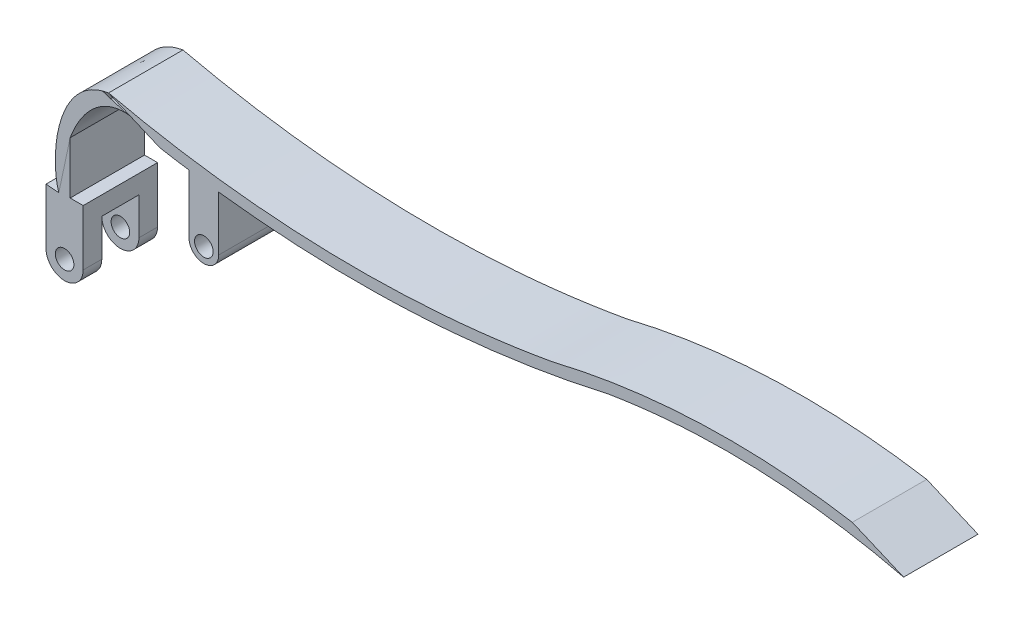
ISO-10303-21;
HEADER;
FILE_DESCRIPTION(('STEP AP214'),'2;1');
FILE_NAME('part.step','',(''),(''),'','','');
FILE_SCHEMA(('AUTOMOTIVE_DESIGN { 1 0 10303 214 1 1 1 1 }'));
ENDSEC;
DATA;
#1=APPLICATION_CONTEXT('core data for automotive mechanical design processes');
#2=APPLICATION_PROTOCOL_DEFINITION('international standard','automotive_design',2000,#1);
#3=PRODUCT_CONTEXT('',#1,'mechanical');
#4=PRODUCT('Part','Part','',(#3));
#5=PRODUCT_RELATED_PRODUCT_CATEGORY('part','',(#4));
#6=PRODUCT_DEFINITION_FORMATION('','',#4);
#7=PRODUCT_DEFINITION_CONTEXT('part definition',#1,'design');
#8=PRODUCT_DEFINITION('design','',#6,#7);
#9=PRODUCT_DEFINITION_SHAPE('','',#8);
#10=(LENGTH_UNIT() NAMED_UNIT(*) SI_UNIT(.MILLI.,.METRE.));
#11=(NAMED_UNIT(*) PLANE_ANGLE_UNIT() SI_UNIT($,.RADIAN.));
#12=(NAMED_UNIT(*) SI_UNIT($,.STERADIAN.) SOLID_ANGLE_UNIT());
#13=UNCERTAINTY_MEASURE_WITH_UNIT(LENGTH_MEASURE(1.E-05),#10,'distance_accuracy_value','');
#14=(GEOMETRIC_REPRESENTATION_CONTEXT(3) GLOBAL_UNCERTAINTY_ASSIGNED_CONTEXT((#13)) GLOBAL_UNIT_ASSIGNED_CONTEXT((#10,
#11,#12)) REPRESENTATION_CONTEXT('',''));
#15=CARTESIAN_POINT('',(0.,0.,0.));
#16=DIRECTION('',(0.,0.,1.));
#17=DIRECTION('',(1.,0.,0.));
#18=AXIS2_PLACEMENT_3D('',#15,#16,#17);
#19=CARTESIAN_POINT('',(-49.458192676,-9.33255592000395,-12.7));
#20=DIRECTION('',(0.,0.,-1.));
#21=DIRECTION('',(-1.,0.,0.));
#22=AXIS2_PLACEMENT_3D('',#19,#20,#21);
#23=PLANE('',#22);
#24=CARTESIAN_POINT('',(-47.553192676,-27.566092696,-12.7));
#25=DIRECTION('',(0.,0.,1.));
#26=DIRECTION('',(1.,0.,0.));
#27=AXIS2_PLACEMENT_3D('',#24,#25,#26);
#28=CIRCLE('',#27,3.175);
#29=CARTESIAN_POINT('',(-44.378192676,-27.566092696,-12.7));
#30=VERTEX_POINT('',#29);
#31=EDGE_CURVE('E230',#30,#30,#28,.T.);
#32=ORIENTED_EDGE('',*,*,#31,.T.);
#33=EDGE_LOOP('',(#32));
#34=FACE_BOUND('',#33,.T.);
#35=CARTESIAN_POINT('',(-47.553192676,-27.566092696,-12.7));
#36=DIRECTION('',(0.,0.,1.));
#37=DIRECTION('',(1.,0.,0.));
#38=AXIS2_PLACEMENT_3D('',#35,#36,#37);
#39=CIRCLE('',#38,6.35000000000001);
#40=CARTESIAN_POINT('',(-53.903192676,-27.566092696,-12.7));
#41=VERTEX_POINT('',#40);
#42=CARTESIAN_POINT('',(-41.203192676,-27.566092696,-12.7));
#43=VERTEX_POINT('',#42);
#44=EDGE_CURVE('E244',#41,#43,#39,.T.);
#45=ORIENTED_EDGE('',*,*,#44,.F.);
#46=DIRECTION('',(0.,-1.,0.));
#47=VECTOR('',#46,1.);
#48=CARTESIAN_POINT('',(-53.903192676,-8.51609269600001,-12.7));
#49=LINE('',#48,#47);
#50=CARTESIAN_POINT('',(-53.903192676,-8.51609269600001,-12.7));
#51=VERTEX_POINT('',#50);
#52=EDGE_CURVE('E707',#51,#41,#49,.T.);
#53=ORIENTED_EDGE('',*,*,#52,.F.);
#54=DIRECTION('',(-1.,0.,0.));
#55=VECTOR('',#54,1.);
#56=CARTESIAN_POINT('',(-53.903192676,-8.51609269600001,-12.7));
#57=LINE('',#56,#55);
#58=CARTESIAN_POINT('',(-49.4815624947602,-8.82240049672864,-12.7));
#59=VERTEX_POINT('',#58);
#60=EDGE_CURVE('E256',#59,#51,#57,.T.);
#61=ORIENTED_EDGE('',*,*,#60,.F.);
#62=DIRECTION('',(0.200000000000001,0.979795897113271,0.));
#63=VECTOR('',#62,1.);
#64=CARTESIAN_POINT('',(-49.458192676,-9.33255592000395,-12.7));
#65=LINE('',#64,#63);
#66=CARTESIAN_POINT('',(-45.648192676,9.3325559200039,-12.7));
#67=VERTEX_POINT('',#66);
#68=EDGE_CURVE('E616',#59,#67,#65,.T.);
#69=ORIENTED_EDGE('',*,*,#68,.T.);
#70=DIRECTION('',(0.,-1.,0.));
#71=VECTOR('',#70,1.);
#72=CARTESIAN_POINT('',(-45.648192676,9.3325559200039,-12.7));
#73=LINE('',#72,#71);
#74=CARTESIAN_POINT('',(-45.648192676,-8.516092696,-12.7));
#75=VERTEX_POINT('',#74);
#76=EDGE_CURVE('E611',#67,#75,#73,.T.);
#77=ORIENTED_EDGE('',*,*,#76,.T.);
#78=CARTESIAN_POINT('',(-41.203192676,-8.516092696,-12.7));
#79=VERTEX_POINT('',#78);
#80=EDGE_CURVE('E66',#79,#75,#57,.T.);
#81=ORIENTED_EDGE('',*,*,#80,.F.);
#82=DIRECTION('',(0.,1.,0.));
#83=VECTOR('',#82,1.);
#84=CARTESIAN_POINT('',(-41.203192676,-27.566092696,-12.7));
#85=LINE('',#84,#83);
#86=EDGE_CURVE('E235',#43,#79,#85,.T.);
#87=ORIENTED_EDGE('',*,*,#86,.F.);
#88=EDGE_LOOP('',(#45,#53,#61,#69,#77,#81,#87));
#89=FACE_BOUND('',#88,.T.);
#90=ADVANCED_FACE('F41',(#34,#89),#23,.T.);
#91=CARTESIAN_POINT('',(-49.458192676,-9.33255592000395,12.7));
#92=DIRECTION('',(0.,0.,1.));
#93=DIRECTION('',(1.,0.,0.));
#94=AXIS2_PLACEMENT_3D('',#91,#92,#93);
#95=PLANE('',#94);
#96=CARTESIAN_POINT('',(-47.553192676,-27.566092696,12.7));
#97=DIRECTION('',(0.,0.,1.));
#98=DIRECTION('',(1.,0.,0.));
#99=AXIS2_PLACEMENT_3D('',#96,#97,#98);
#100=CIRCLE('',#99,3.175);
#101=CARTESIAN_POINT('',(-44.378192676,-27.566092696,12.7));
#102=VERTEX_POINT('',#101);
#103=EDGE_CURVE('E231',#102,#102,#100,.T.);
#104=ORIENTED_EDGE('',*,*,#103,.F.);
#105=EDGE_LOOP('',(#104));
#106=FACE_BOUND('',#105,.T.);
#107=DIRECTION('',(0.,-1.,0.));
#108=VECTOR('',#107,1.);
#109=CARTESIAN_POINT('',(-53.903192676,-8.51609269600001,12.7));
#110=LINE('',#109,#108);
#111=CARTESIAN_POINT('',(-53.903192676,-8.51609269600001,12.7));
#112=VERTEX_POINT('',#111);
#113=CARTESIAN_POINT('',(-53.903192676,-27.566092696,12.7));
#114=VERTEX_POINT('',#113);
#115=EDGE_CURVE('E250',#112,#114,#110,.T.);
#116=ORIENTED_EDGE('',*,*,#115,.T.);
#117=CARTESIAN_POINT('',(-47.553192676,-27.566092696,12.7));
#118=DIRECTION('',(0.,0.,1.));
#119=DIRECTION('',(1.,0.,0.));
#120=AXIS2_PLACEMENT_3D('',#117,#118,#119);
#121=CIRCLE('',#120,6.35000000000001);
#122=CARTESIAN_POINT('',(-41.203192676,-27.566092696,12.7));
#123=VERTEX_POINT('',#122);
#124=EDGE_CURVE('E717',#114,#123,#121,.T.);
#125=ORIENTED_EDGE('',*,*,#124,.T.);
#126=DIRECTION('',(0.,1.,0.));
#127=VECTOR('',#126,1.);
#128=CARTESIAN_POINT('',(-41.203192676,-27.566092696,12.7));
#129=LINE('',#128,#127);
#130=CARTESIAN_POINT('',(-41.203192676,-8.516092696,12.7));
#131=VERTEX_POINT('',#130);
#132=EDGE_CURVE('E239',#123,#131,#129,.T.);
#133=ORIENTED_EDGE('',*,*,#132,.T.);
#134=DIRECTION('',(-1.,0.,0.));
#135=VECTOR('',#134,1.);
#136=CARTESIAN_POINT('',(-53.903192676,-8.51609269600001,12.7));
#137=LINE('',#136,#135);
#138=CARTESIAN_POINT('',(-45.648192676,-8.516092696,12.7));
#139=VERTEX_POINT('',#138);
#140=EDGE_CURVE('E245',#131,#139,#137,.T.);
#141=ORIENTED_EDGE('',*,*,#140,.T.);
#142=DIRECTION('',(0.,-1.,0.));
#143=VECTOR('',#142,1.);
#144=CARTESIAN_POINT('',(-45.648192676,9.3325559200039,12.7));
#145=LINE('',#144,#143);
#146=CARTESIAN_POINT('',(-45.648192676,9.3325559200039,12.7));
#147=VERTEX_POINT('',#146);
#148=EDGE_CURVE('E681',#147,#139,#145,.T.);
#149=ORIENTED_EDGE('',*,*,#148,.F.);
#150=DIRECTION('',(-0.200000000000001,-0.979795897113271,0.));
#151=VECTOR('',#150,1.);
#152=CARTESIAN_POINT('',(-49.458192676,-9.33255592000395,12.7));
#153=LINE('',#152,#151);
#154=CARTESIAN_POINT('',(-49.5273887485295,-8.86460792080435,12.7));
#155=VERTEX_POINT('',#154);
#156=EDGE_CURVE('E612',#147,#155,#153,.T.);
#157=ORIENTED_EDGE('',*,*,#156,.T.);
#158=EDGE_CURVE('E243',#155,#112,#137,.T.);
#159=ORIENTED_EDGE('',*,*,#158,.T.);
#160=EDGE_LOOP('',(#116,#125,#133,#141,#149,#157,#159));
#161=FACE_BOUND('',#160,.T.);
#162=ADVANCED_FACE('F508',(#106,#161),#95,.T.);
#163=CARTESIAN_POINT('',(-18.3079420768037,-33.916092696,-6.35));
#164=DIRECTION('',(0.,0.,-1.));
#165=DIRECTION('',(0.,1.,0.));
#166=AXIS2_PLACEMENT_3D('',#163,#164,#165);
#167=PLANE('',#166);
#168=CARTESIAN_POINT('',(-47.553192676,-27.566092696,-6.35));
#169=DIRECTION('',(0.,0.,-1.));
#170=DIRECTION('',(0.,1.,0.));
#171=AXIS2_PLACEMENT_3D('',#168,#169,#170);
#172=CIRCLE('',#171,3.175);
#173=CARTESIAN_POINT('',(-47.553192676,-24.391092696,-6.35));
#174=VERTEX_POINT('',#173);
#175=EDGE_CURVE('E222',#174,#174,#172,.T.);
#176=ORIENTED_EDGE('',*,*,#175,.T.);
#177=EDGE_LOOP('',(#176));
#178=FACE_BOUND('',#177,.T.);
#179=CARTESIAN_POINT('',(-47.553192676,-27.566092696,-6.35));
#180=DIRECTION('',(0.,0.,-1.));
#181=DIRECTION('',(0.,1.,0.));
#182=AXIS2_PLACEMENT_3D('',#179,#180,#181);
#183=CIRCLE('',#182,6.35000000000001);
#184=CARTESIAN_POINT('',(-41.203192676,-27.566092696,-6.35));
#185=VERTEX_POINT('',#184);
#186=CARTESIAN_POINT('',(-53.903192676,-27.566092696,-6.35));
#187=VERTEX_POINT('',#186);
#188=EDGE_CURVE('E226',#185,#187,#183,.T.);
#189=ORIENTED_EDGE('',*,*,#188,.F.);
#190=DIRECTION('',(0.,-1.,0.));
#191=VECTOR('',#190,1.);
#192=CARTESIAN_POINT('',(-41.203192676,-27.566092696,-6.35));
#193=LINE('',#192,#191);
#194=CARTESIAN_POINT('',(-41.203192676,-14.866092696,-6.35));
#195=VERTEX_POINT('',#194);
#196=EDGE_CURVE('E11',#195,#185,#193,.T.);
#197=ORIENTED_EDGE('',*,*,#196,.F.);
#198=DIRECTION('',(-1.,0.,0.));
#199=VECTOR('',#198,1.);
#200=CARTESIAN_POINT('',(-18.3079420768037,-14.866092696,-6.35));
#201=LINE('',#200,#199);
#202=CARTESIAN_POINT('',(-53.903192676,-14.866092696,-6.35));
#203=VERTEX_POINT('',#202);
#204=EDGE_CURVE('E205',#195,#203,#201,.T.);
#205=ORIENTED_EDGE('',*,*,#204,.T.);
#206=DIRECTION('',(0.,-1.,0.));
#207=VECTOR('',#206,1.);
#208=CARTESIAN_POINT('',(-53.903192676,-33.916092696,-6.35));
#209=LINE('',#208,#207);
#210=EDGE_CURVE('E194',#203,#187,#209,.T.);
#211=ORIENTED_EDGE('',*,*,#210,.T.);
#212=EDGE_LOOP('',(#189,#197,#205,#211));
#213=FACE_BOUND('',#212,.T.);
#214=ADVANCED_FACE('F512',(#178,#213),#167,.F.);
#215=CARTESIAN_POINT('',(-18.3079420768037,-14.866092696,6.35));
#216=DIRECTION('',(0.,0.,1.));
#217=DIRECTION('',(1.,0.,0.));
#218=AXIS2_PLACEMENT_3D('',#215,#216,#217);
#219=PLANE('',#218);
#220=CARTESIAN_POINT('',(-47.553192676,-27.566092696,6.35));
#221=DIRECTION('',(0.,0.,1.));
#222=DIRECTION('',(1.,0.,0.));
#223=AXIS2_PLACEMENT_3D('',#220,#221,#222);
#224=CIRCLE('',#223,3.175);
#225=CARTESIAN_POINT('',(-44.378192676,-27.566092696,6.35));
#226=VERTEX_POINT('',#225);
#227=EDGE_CURVE('E216',#226,#226,#224,.T.);
#228=ORIENTED_EDGE('',*,*,#227,.T.);
#229=EDGE_LOOP('',(#228));
#230=FACE_BOUND('',#229,.T.);
#231=CARTESIAN_POINT('',(-47.553192676,-27.566092696,6.35));
#232=DIRECTION('',(0.,0.,1.));
#233=DIRECTION('',(1.,0.,0.));
#234=AXIS2_PLACEMENT_3D('',#231,#232,#233);
#235=CIRCLE('',#234,6.35000000000001);
#236=CARTESIAN_POINT('',(-53.903192676,-27.566092696,6.35));
#237=VERTEX_POINT('',#236);
#238=CARTESIAN_POINT('',(-41.203192676,-27.566092696,6.35));
#239=VERTEX_POINT('',#238);
#240=EDGE_CURVE('E187',#237,#239,#235,.T.);
#241=ORIENTED_EDGE('',*,*,#240,.F.);
#242=DIRECTION('',(0.,1.,0.));
#243=VECTOR('',#242,1.);
#244=CARTESIAN_POINT('',(-53.903192676,-14.866092696,6.35));
#245=LINE('',#244,#243);
#246=CARTESIAN_POINT('',(-53.903192676,-14.866092696,6.35));
#247=VERTEX_POINT('',#246);
#248=EDGE_CURVE('E185',#237,#247,#245,.T.);
#249=ORIENTED_EDGE('',*,*,#248,.T.);
#250=DIRECTION('',(-1.,0.,0.));
#251=VECTOR('',#250,1.);
#252=CARTESIAN_POINT('',(-18.3079420768037,-14.866092696,6.35));
#253=LINE('',#252,#251);
#254=CARTESIAN_POINT('',(-41.203192676,-14.866092696,6.35));
#255=VERTEX_POINT('',#254);
#256=EDGE_CURVE('E58',#255,#247,#253,.T.);
#257=ORIENTED_EDGE('',*,*,#256,.F.);
#258=DIRECTION('',(0.,-1.,0.));
#259=VECTOR('',#258,1.);
#260=CARTESIAN_POINT('',(-41.203192676,-14.866092696,6.35));
#261=LINE('',#260,#259);
#262=EDGE_CURVE('E214',#255,#239,#261,.T.);
#263=ORIENTED_EDGE('',*,*,#262,.T.);
#264=EDGE_LOOP('',(#241,#249,#257,#263));
#265=FACE_BOUND('',#264,.T.);
#266=ADVANCED_FACE('F186',(#230,#265),#219,.F.);
#267=CARTESIAN_POINT('',(-47.553192676,-27.566092696,12.7));
#268=DIRECTION('',(0.,0.,-1.));
#269=DIRECTION('',(-1.,0.,0.));
#270=AXIS2_PLACEMENT_3D('',#267,#268,#269);
#271=CYLINDRICAL_SURFACE('',#270,3.175);
#272=ORIENTED_EDGE('',*,*,#175,.F.);
#273=EDGE_LOOP('',(#272));
#274=FACE_BOUND('',#273,.T.);
#275=ORIENTED_EDGE('',*,*,#31,.F.);
#276=EDGE_LOOP('',(#275));
#277=FACE_BOUND('',#276,.T.);
#278=ADVANCED_FACE('F881',(#274,#277),#271,.F.);
#279=CARTESIAN_POINT('',(-45.648192676,9.3325559200039,12.7));
#280=DIRECTION('',(1.,0.,0.));
#281=DIRECTION('',(0.,0.,-1.));
#282=AXIS2_PLACEMENT_3D('',#279,#280,#281);
#283=PLANE('',#282);
#284=ORIENTED_EDGE('',*,*,#148,.T.);
#285=DIRECTION('',(0.,0.,-1.));
#286=VECTOR('',#285,1.);
#287=CARTESIAN_POINT('',(-45.648192676,-8.516092696,12.7));
#288=LINE('',#287,#286);
#289=EDGE_CURVE('E270',#139,#75,#288,.T.);
#290=ORIENTED_EDGE('',*,*,#289,.T.);
#291=ORIENTED_EDGE('',*,*,#76,.F.);
#292=DIRECTION('',(0.,0.,1.));
#293=VECTOR('',#292,1.);
#294=CARTESIAN_POINT('',(-45.648192676,9.3325559200039,12.7));
#295=LINE('',#294,#293);
#296=EDGE_CURVE('E700',#67,#147,#295,.T.);
#297=ORIENTED_EDGE('',*,*,#296,.T.);
#298=EDGE_LOOP('',(#284,#290,#291,#297));
#299=FACE_BOUND('',#298,.T.);
#300=ADVANCED_FACE('F388',(#299),#283,.T.);
#301=CARTESIAN_POINT('',(238.986403662,21.6669776319984,-12.7));
#302=CARTESIAN_POINT('',(206.25106877289,29.6210179557886,-12.7));
#303=CARTESIAN_POINT('',(171.556118637081,32.00616021808,-12.7));
#304=CARTESIAN_POINT('',(113.092617430688,20.44537983644,-12.7));
#305=CARTESIAN_POINT('',(88.9185711269797,16.6119728038297,-12.7));
#306=CARTESIAN_POINT('',(39.0802832672392,15.1050154498448,-12.7));
#307=CARTESIAN_POINT('',(13.3193114699038,16.5993181582046,-12.7));
#308=CARTESIAN_POINT('',(-15.013596338,21.6669776319983,-12.7));
#309=CARTESIAN_POINT('',(238.986403662,21.6669776319984,-4.23333333333333));
#310=CARTESIAN_POINT('',(206.25106877289,29.6210179557886,-4.23333333333333));
#311=CARTESIAN_POINT('',(171.556118637081,32.00616021808,-4.23333333333333));
#312=CARTESIAN_POINT('',(113.092617430688,20.44537983644,-4.23333333333333));
#313=CARTESIAN_POINT('',(88.9185711269797,16.6119728038297,-4.23333333333333));
#314=CARTESIAN_POINT('',(39.0802832672392,15.1050154498448,-4.23333333333333));
#315=CARTESIAN_POINT('',(13.3193114699038,16.5993181582046,-4.23333333333333));
#316=CARTESIAN_POINT('',(-15.013596338,21.6669776319983,-4.23333333333333));
#317=CARTESIAN_POINT('',(238.986403662,21.6669776319984,4.23333333333334));
#318=CARTESIAN_POINT('',(206.25106877289,29.6210179557886,4.23333333333334));
#319=CARTESIAN_POINT('',(171.556118637081,32.00616021808,4.23333333333334));
#320=CARTESIAN_POINT('',(113.092617430688,20.44537983644,4.23333333333334));
#321=CARTESIAN_POINT('',(88.9185711269797,16.6119728038297,4.23333333333334));
#322=CARTESIAN_POINT('',(39.0802832672392,15.1050154498448,4.23333333333334));
#323=CARTESIAN_POINT('',(13.3193114699038,16.5993181582046,4.23333333333334));
#324=CARTESIAN_POINT('',(-15.013596338,21.6669776319983,4.23333333333334));
#325=CARTESIAN_POINT('',(238.986403662,21.6669776319984,12.7));
#326=CARTESIAN_POINT('',(206.25106877289,29.6210179557886,12.7));
#327=CARTESIAN_POINT('',(171.556118637081,32.00616021808,12.7));
#328=CARTESIAN_POINT('',(113.092617430688,20.44537983644,12.7));
#329=CARTESIAN_POINT('',(88.9185711269797,16.6119728038297,12.7));
#330=CARTESIAN_POINT('',(39.0802832672392,15.1050154498448,12.7));
#331=CARTESIAN_POINT('',(13.3193114699038,16.5993181582046,12.7));
#332=CARTESIAN_POINT('',(-15.013596338,21.6669776319983,12.7));
#333=B_SPLINE_SURFACE_WITH_KNOTS('',3,3,((#301,#302,#303,#304,#305,#306,#307,#308),(#309,#310,
#311,#312,#313,#314,#315,#316),(#317,#318,#319,#320,#321,#322,#323,#324),(#325,#326,#327,#328,
#329,#330,#331,#332)),.UNSPECIFIED.,.F.,.F.,.F.,(4,4),(4,2,2,4),(0.,1.),(0.,0.316328117430468,
0.553574205503316,0.790820293576165),.UNSPECIFIED.);
#334=CARTESIAN_POINT('',(52.4234036619993,398.702236800156,12.7));
#335=DIRECTION('',(0.,0.,-1.));
#336=DIRECTION('',(0.223814129085897,-0.974631846197076,0.));
#337=AXIS2_PLACEMENT_3D('',#334,#335,#336);
#338=CIRCLE('',#337,383.018714457923);
#339=CARTESIAN_POINT('',(138.148403661999,25.4,12.7));
#340=VERTEX_POINT('',#339);
#341=CARTESIAN_POINT('',(5.08,18.6035817785818,12.7));
#342=VERTEX_POINT('',#341);
#343=EDGE_CURVE('E467',#340,#342,#338,.T.);
#344=DIRECTION('',(0.,0.,1.));
#345=VECTOR('',#344,1.);
#346=CARTESIAN_POINT('',(5.08000000000002,18.6030074793126,0.));
#347=LINE('',#346,#345);
#348=CARTESIAN_POINT('',(5.08,18.6035817785211,-12.7));
#349=VERTEX_POINT('',#348);
#350=EDGE_CURVE('E669',#342,#349,#347,.F.);
#351=CARTESIAN_POINT('',(52.4234036619993,398.702236800156,-12.7));
#352=DIRECTION('',(0.,0.,-1.));
#353=DIRECTION('',(0.223814129085897,-0.974631846197076,0.));
#354=AXIS2_PLACEMENT_3D('',#351,#352,#353);
#355=CIRCLE('',#354,383.018714457923);
#356=CARTESIAN_POINT('',(138.148403661999,25.4,-12.7));
#357=VERTEX_POINT('',#356);
#358=EDGE_CURVE('E426',#357,#349,#355,.T.);
#359=CARTESIAN_POINT('',(179.423403662,-223.468157866771,-12.7));
#360=DIRECTION('',(0.,0.,1.));
#361=DIRECTION('',(0.23611030345999,0.971726260116516,0.));
#362=AXIS2_PLACEMENT_3D('',#359,#360,#361);
#363=CIRCLE('',#362,252.267686446362);
#364=CARTESIAN_POINT('',(238.986403662,21.6669776319984,-12.7));
#365=VERTEX_POINT('',#364);
#366=EDGE_CURVE('E351',#365,#357,#363,.T.);
#367=DIRECTION('',(0.,0.,1.));
#368=VECTOR('',#367,1.);
#369=CARTESIAN_POINT('',(238.986403662,21.6669776319984,12.7));
#370=LINE('',#369,#368);
#371=CARTESIAN_POINT('',(238.986403662,21.6669776319984,12.7));
#372=VERTEX_POINT('',#371);
#373=EDGE_CURVE('E806',#365,#372,#370,.T.);
#374=CARTESIAN_POINT('',(179.423403662,-223.468157866771,12.7));
#375=DIRECTION('',(0.,0.,1.));
#376=DIRECTION('',(0.23611030345999,0.971726260116516,0.));
#377=AXIS2_PLACEMENT_3D('',#374,#375,#376);
#378=CIRCLE('',#377,252.267686446362);
#379=EDGE_CURVE('E823',#372,#340,#378,.T.);
#380=ORIENTED_EDGE('',*,*,#343,.T.);
#381=ORIENTED_EDGE('',*,*,#350,.T.);
#382=ORIENTED_EDGE('',*,*,#358,.F.);
#383=ORIENTED_EDGE('',*,*,#366,.F.);
#384=ORIENTED_EDGE('',*,*,#373,.T.);
#385=ORIENTED_EDGE('',*,*,#379,.T.);
#386=EDGE_LOOP('',(#380,#381,#382,#383,#384,#385));
#387=FACE_BOUND('',#386,.T.);
#388=ADVANCED_FACE('F376',(#387),#333,.T.);
#389=CARTESIAN_POINT('',(-5.08000004562513,20.7540625375772,-12.7));
#390=VERTEX_POINT('',#389);
#391=CARTESIAN_POINT('',(-15.013596338,21.6669776319983,-12.7));
#392=VERTEX_POINT('',#391);
#393=EDGE_CURVE('E420',#390,#392,#355,.T.);
#394=DIRECTION('',(0.,0.,1.));
#395=VECTOR('',#394,1.);
#396=CARTESIAN_POINT('',(-5.08000000000001,20.0188395452895,0.));
#397=LINE('',#396,#395);
#398=CARTESIAN_POINT('',(-5.07999999999992,20.0605625867438,12.7));
#399=VERTEX_POINT('',#398);
#400=EDGE_CURVE('E51',#390,#399,#397,.T.);
#401=CARTESIAN_POINT('',(-15.013596338,21.6669776319983,12.7));
#402=VERTEX_POINT('',#401);
#403=EDGE_CURVE('E361',#399,#402,#338,.T.);
#404=DIRECTION('',(0.,0.,1.));
#405=VECTOR('',#404,1.);
#406=CARTESIAN_POINT('',(-15.013596338,21.6669776319983,12.7));
#407=LINE('',#406,#405);
#408=EDGE_CURVE('E418',#392,#402,#407,.T.);
#409=ORIENTED_EDGE('',*,*,#393,.F.);
#410=ORIENTED_EDGE('',*,*,#400,.T.);
#411=ORIENTED_EDGE('',*,*,#403,.T.);
#412=ORIENTED_EDGE('',*,*,#408,.F.);
#413=EDGE_LOOP('',(#409,#410,#411,#412));
#414=FACE_BOUND('',#413,.T.);
#415=ADVANCED_FACE('F387',(#414),#333,.T.);
#416=CARTESIAN_POINT('',(111.889872292961,75.8098732723087,0.));
#417=DIRECTION('',(-0.39191835884531,-0.919999999999999,0.));
#418=DIRECTION('',(0.,0.,-1.));
#419=AXIS2_PLACEMENT_3D('',#416,#417,#418);
#420=PLANE('',#419);
#421=DIRECTION('',(0.919999999999999,-0.39191835884531,0.));
#422=VECTOR('',#421,1.);
#423=CARTESIAN_POINT('',(221.460403662,29.1330223680016,-12.7));
#424=LINE('',#423,#422);
#425=CARTESIAN_POINT('',(221.460403662,29.1330223680016,-12.7));
#426=VERTEX_POINT('',#425);
#427=EDGE_CURVE('E763',#426,#365,#424,.T.);
#428=ORIENTED_EDGE('',*,*,#427,.F.);
#429=DIRECTION('',(0.,0.,-1.));
#430=VECTOR('',#429,1.);
#431=CARTESIAN_POINT('',(221.460403662,29.1330223680016,12.7));
#432=LINE('',#431,#430);
#433=CARTESIAN_POINT('',(221.460403662,29.1330223680016,12.7));
#434=VERTEX_POINT('',#433);
#435=EDGE_CURVE('E352',#434,#426,#432,.T.);
#436=ORIENTED_EDGE('',*,*,#435,.F.);
#437=DIRECTION('',(-0.919999999999999,0.39191835884531,0.));
#438=VECTOR('',#437,1.);
#439=CARTESIAN_POINT('',(221.460403662,29.1330223680016,12.7));
#440=LINE('',#439,#438);
#441=EDGE_CURVE('E801',#372,#434,#440,.T.);
#442=ORIENTED_EDGE('',*,*,#441,.F.);
#443=ORIENTED_EDGE('',*,*,#373,.F.);
#444=EDGE_LOOP('',(#428,#436,#442,#443));
#445=FACE_BOUND('',#444,.T.);
#446=ADVANCED_FACE('F43',(#445),#420,.F.);
#447=CARTESIAN_POINT('',(221.460403662,29.1330223680016,-12.7));
#448=DIRECTION('',(0.,0.,-1.));
#449=DIRECTION('',(-1.,0.,0.));
#450=AXIS2_PLACEMENT_3D('',#447,#448,#449);
#451=PLANE('',#450);
#452=ORIENTED_EDGE('',*,*,#358,.T.);
#453=DIRECTION('',(0.,1.,0.));
#454=VECTOR('',#453,1.);
#455=CARTESIAN_POINT('',(5.08,21.3260494903434,-12.7));
#456=LINE('',#455,#454);
#457=CARTESIAN_POINT('',(5.08,0.,-12.7));
#458=VERTEX_POINT('',#457);
#459=EDGE_CURVE('E663',#458,#349,#456,.T.);
#460=ORIENTED_EDGE('',*,*,#459,.F.);
#461=CARTESIAN_POINT('',(0.,0.,-12.7));
#462=DIRECTION('',(0.,0.,1.));
#463=DIRECTION('',(1.,0.,0.));
#464=AXIS2_PLACEMENT_3D('',#461,#462,#463);
#465=CIRCLE('',#464,5.08);
#466=CARTESIAN_POINT('',(-5.08,0.,-12.7));
#467=VERTEX_POINT('',#466);
#468=EDGE_CURVE('E759',#467,#458,#465,.T.);
#469=ORIENTED_EDGE('',*,*,#468,.F.);
#470=DIRECTION('',(0.,-1.,0.));
#471=VECTOR('',#470,1.);
#472=CARTESIAN_POINT('',(-5.08,21.3260494903433,-12.7));
#473=LINE('',#472,#471);
#474=EDGE_CURVE('E767',#390,#467,#473,.T.);
#475=ORIENTED_EDGE('',*,*,#474,.F.);
#476=ORIENTED_EDGE('',*,*,#393,.T.);
#477=DIRECTION('',(0.92,-0.391918358845308,0.));
#478=VECTOR('',#477,1.);
#479=CARTESIAN_POINT('',(-32.5395963380001,29.1330223680015,-12.7));
#480=LINE('',#479,#478);
#481=CARTESIAN_POINT('',(-32.5395963380001,29.1330223680015,-12.7));
#482=VERTEX_POINT('',#481);
#483=EDGE_CURVE('E430',#482,#392,#480,.T.);
#484=ORIENTED_EDGE('',*,*,#483,.F.);
#485=CARTESIAN_POINT('',(52.4234036619993,398.702236800156,-12.7));
#486=DIRECTION('',(0.,0.,-1.));
#487=DIRECTION('',(0.175826125756165,-0.9844212378355,0.));
#488=AXIS2_PLACEMENT_3D('',#485,#486,#487);
#489=CIRCLE('',#488,379.209856972363);
#490=CARTESIAN_POINT('',(119.098403661999,25.4,-12.7));
#491=VERTEX_POINT('',#490);
#492=EDGE_CURVE('E440',#491,#482,#489,.T.);
#493=ORIENTED_EDGE('',*,*,#492,.F.);
#494=CARTESIAN_POINT('',(179.423403662,-223.468157866771,-12.7));
#495=DIRECTION('',(0.,0.,1.));
#496=DIRECTION('',(0.164158862709254,0.986433914559918,0.));
#497=AXIS2_PLACEMENT_3D('',#494,#495,#496);
#498=CIRCLE('',#497,256.075117153151);
#499=EDGE_CURVE('E346',#426,#491,#498,.T.);
#500=ORIENTED_EDGE('',*,*,#499,.F.);
#501=ORIENTED_EDGE('',*,*,#427,.T.);
#502=ORIENTED_EDGE('',*,*,#366,.T.);
#503=EDGE_LOOP('',(#452,#460,#469,#475,#476,#484,#493,#500,#501,#502));
#504=FACE_BOUND('',#503,.T.);
#505=CARTESIAN_POINT('',(0.,0.,-12.7));
#506=DIRECTION('',(0.,0.,1.));
#507=DIRECTION('',(1.,0.,0.));
#508=AXIS2_PLACEMENT_3D('',#505,#506,#507);
#509=CIRCLE('',#508,3.175);
#510=CARTESIAN_POINT('',(3.175,0.,-12.7));
#511=VERTEX_POINT('',#510);
#512=EDGE_CURVE('E739',#511,#511,#509,.T.);
#513=ORIENTED_EDGE('',*,*,#512,.T.);
#514=EDGE_LOOP('',(#513));
#515=FACE_BOUND('',#514,.T.);
#516=ADVANCED_FACE('F307',(#504,#515),#451,.T.);
#517=CARTESIAN_POINT('',(221.460403662,29.1330223680016,12.7));
#518=DIRECTION('',(0.,0.,1.));
#519=DIRECTION('',(1.,0.,0.));
#520=AXIS2_PLACEMENT_3D('',#517,#518,#519);
#521=PLANE('',#520);
#522=ORIENTED_EDGE('',*,*,#403,.F.);
#523=DIRECTION('',(0.,-1.,0.));
#524=VECTOR('',#523,1.);
#525=CARTESIAN_POINT('',(-5.08,21.3260494903433,12.7));
#526=LINE('',#525,#524);
#527=CARTESIAN_POINT('',(-5.08,0.,12.7));
#528=VERTEX_POINT('',#527);
#529=EDGE_CURVE('E758',#399,#528,#526,.T.);
#530=ORIENTED_EDGE('',*,*,#529,.T.);
#531=CARTESIAN_POINT('',(0.,0.,12.7));
#532=DIRECTION('',(0.,0.,1.));
#533=DIRECTION('',(1.,0.,0.));
#534=AXIS2_PLACEMENT_3D('',#531,#532,#533);
#535=CIRCLE('',#534,5.08);
#536=CARTESIAN_POINT('',(5.08,0.,12.7));
#537=VERTEX_POINT('',#536);
#538=EDGE_CURVE('E750',#528,#537,#535,.T.);
#539=ORIENTED_EDGE('',*,*,#538,.T.);
#540=DIRECTION('',(0.,1.,0.));
#541=VECTOR('',#540,1.);
#542=CARTESIAN_POINT('',(5.08,21.3260494903434,12.7));
#543=LINE('',#542,#541);
#544=EDGE_CURVE('E753',#537,#342,#543,.T.);
#545=ORIENTED_EDGE('',*,*,#544,.T.);
#546=ORIENTED_EDGE('',*,*,#343,.F.);
#547=ORIENTED_EDGE('',*,*,#379,.F.);
#548=ORIENTED_EDGE('',*,*,#441,.T.);
#549=CARTESIAN_POINT('',(179.423403662,-223.468157866771,12.7));
#550=DIRECTION('',(0.,0.,1.));
#551=DIRECTION('',(0.164158862709254,0.986433914559918,0.));
#552=AXIS2_PLACEMENT_3D('',#549,#550,#551);
#553=CIRCLE('',#552,256.075117153151);
#554=CARTESIAN_POINT('',(119.098403661999,25.4,12.7));
#555=VERTEX_POINT('',#554);
#556=EDGE_CURVE('E445',#434,#555,#553,.T.);
#557=ORIENTED_EDGE('',*,*,#556,.T.);
#558=CARTESIAN_POINT('',(52.4234036619993,398.702236800156,12.7));
#559=DIRECTION('',(0.,0.,-1.));
#560=DIRECTION('',(0.175826125756165,-0.9844212378355,0.));
#561=AXIS2_PLACEMENT_3D('',#558,#559,#560);
#562=CIRCLE('',#561,379.209856972363);
#563=CARTESIAN_POINT('',(-32.5395963380001,29.1330223680014,12.7));
#564=VERTEX_POINT('',#563);
#565=EDGE_CURVE('E456',#555,#564,#562,.T.);
#566=ORIENTED_EDGE('',*,*,#565,.T.);
#567=DIRECTION('',(-0.92,0.391918358845308,0.));
#568=VECTOR('',#567,1.);
#569=CARTESIAN_POINT('',(-32.5395963380001,29.1330223680015,12.7));
#570=LINE('',#569,#568);
#571=EDGE_CURVE('E463',#402,#564,#570,.T.);
#572=ORIENTED_EDGE('',*,*,#571,.F.);
#573=EDGE_LOOP('',(#522,#530,#539,#545,#546,#547,#548,#557,#566,#572));
#574=FACE_BOUND('',#573,.T.);
#575=CARTESIAN_POINT('',(0.,0.,12.7));
#576=DIRECTION('',(0.,0.,1.));
#577=DIRECTION('',(1.,0.,0.));
#578=AXIS2_PLACEMENT_3D('',#575,#576,#577);
#579=CIRCLE('',#578,3.175);
#580=CARTESIAN_POINT('',(3.175,0.,12.7));
#581=VERTEX_POINT('',#580);
#582=EDGE_CURVE('E742',#581,#581,#579,.T.);
#583=ORIENTED_EDGE('',*,*,#582,.F.);
#584=EDGE_LOOP('',(#583));
#585=FACE_BOUND('',#584,.T.);
#586=ADVANCED_FACE('F311',(#574,#585),#521,.T.);
#587=CARTESIAN_POINT('',(221.460403662,29.1330223680016,12.7));
#588=CARTESIAN_POINT('',(187.409268547844,34.799692515414,12.7));
#589=CARTESIAN_POINT('',(152.506120035581,32.432368419525,12.7));
#590=CARTESIAN_POINT('',(94.0426163818136,20.1257236853563,12.7));
#591=CARTESIAN_POINT('',(69.9905866780551,19.0962025652763,12.7));
#592=CARTESIAN_POINT('',(20.6340355724699,20.021918822539,12.7));
#593=CARTESIAN_POINT('',(-4.76773620956855,22.7483440470996,12.7));
#594=CARTESIAN_POINT('',(-32.5395963380001,29.1330223680015,12.7));
#595=CARTESIAN_POINT('',(221.460403662,29.1330223680016,4.23333333333334));
#596=CARTESIAN_POINT('',(187.409268547844,34.799692515414,4.23333333333334));
#597=CARTESIAN_POINT('',(152.506120035581,32.432368419525,4.23333333333334));
#598=CARTESIAN_POINT('',(94.0426163818136,20.1257236853563,4.23333333333334));
#599=CARTESIAN_POINT('',(69.9905866780551,19.0962025652763,4.23333333333334));
#600=CARTESIAN_POINT('',(20.6340355724699,20.021918822539,4.23333333333334));
#601=CARTESIAN_POINT('',(-4.76773620956855,22.7483440470996,4.23333333333334));
#602=CARTESIAN_POINT('',(-32.5395963380001,29.1330223680015,4.23333333333334));
#603=CARTESIAN_POINT('',(221.460403662,29.1330223680016,-4.23333333333333));
#604=CARTESIAN_POINT('',(187.409268547844,34.799692515414,-4.23333333333333));
#605=CARTESIAN_POINT('',(152.506120035581,32.432368419525,-4.23333333333333));
#606=CARTESIAN_POINT('',(94.0426163818136,20.1257236853563,-4.23333333333333));
#607=CARTESIAN_POINT('',(69.9905866780551,19.0962025652763,-4.23333333333333));
#608=CARTESIAN_POINT('',(20.6340355724699,20.021918822539,-4.23333333333333));
#609=CARTESIAN_POINT('',(-4.76773620956855,22.7483440470996,-4.23333333333333));
#610=CARTESIAN_POINT('',(-32.5395963380001,29.1330223680015,-4.23333333333333));
#611=CARTESIAN_POINT('',(221.460403662,29.1330223680016,-12.7));
#612=CARTESIAN_POINT('',(187.409268547844,34.799692515414,-12.7));
#613=CARTESIAN_POINT('',(152.506120035581,32.432368419525,-12.7));
#614=CARTESIAN_POINT('',(94.0426163818136,20.1257236853563,-12.7));
#615=CARTESIAN_POINT('',(69.9905866780551,19.0962025652763,-12.7));
#616=CARTESIAN_POINT('',(20.6340355724699,20.021918822539,-12.7));
#617=CARTESIAN_POINT('',(-4.76773620956855,22.7483440470996,-12.7));
#618=CARTESIAN_POINT('',(-32.5395963380001,29.1330223680015,-12.7));
#619=B_SPLINE_SURFACE_WITH_KNOTS('',3,3,((#587,#588,#589,#590,#591,#592,#593,#594),(#595,#596,
#597,#598,#599,#600,#601,#602),(#603,#604,#605,#606,#607,#608,#609,#610),(#611,#612,#613,#614,
#615,#616,#617,#618)),.UNSPECIFIED.,.F.,.F.,.F.,(4,4),(4,2,2,4),(0.,1.),(0.,0.316328117430468,
0.553574205503316,0.790820293576165),.UNSPECIFIED.);
#620=DIRECTION('',(0.,0.,-1.));
#621=VECTOR('',#620,1.);
#622=CARTESIAN_POINT('',(-32.5395963380001,29.1330223680015,12.7));
#623=LINE('',#622,#621);
#624=EDGE_CURVE('E452',#564,#482,#623,.T.);
#625=ORIENTED_EDGE('',*,*,#624,.F.);
#626=ORIENTED_EDGE('',*,*,#565,.F.);
#627=ORIENTED_EDGE('',*,*,#556,.F.);
#628=ORIENTED_EDGE('',*,*,#435,.T.);
#629=ORIENTED_EDGE('',*,*,#499,.T.);
#630=ORIENTED_EDGE('',*,*,#492,.T.);
#631=EDGE_LOOP('',(#625,#626,#627,#628,#629,#630));
#632=FACE_BOUND('',#631,.T.);
#633=ADVANCED_FACE('F514',(#632),#619,.T.);
#634=CARTESIAN_POINT('',(-32.539596338,29.1330223680016,-12.7));
#635=DIRECTION('',(0.,0.,-1.));
#636=DIRECTION('',(-1.,0.,0.));
#637=AXIS2_PLACEMENT_3D('',#634,#635,#636);
#638=PLANE('',#637);
#639=CARTESIAN_POINT('',(-15.013596338,21.6669776319983,-12.7));
#640=CARTESIAN_POINT('',(-29.6883695230407,32.1140522863024,-12.7));
#641=CARTESIAN_POINT('',(-40.7239668522363,22.7331629264991,-12.7));
#642=CARTESIAN_POINT('',(-45.648192676,9.3325559200039,-12.7));
#643=B_SPLINE_CURVE_WITH_KNOTS('',3,(#639,#640,#641,#642),.UNSPECIFIED.,.F.,.F.,(4,4),
(0.790820293576165,0.914752710613991),.UNSPECIFIED.);
#644=EDGE_CURVE('E432',#392,#67,#643,.T.);
#645=ORIENTED_EDGE('',*,*,#644,.T.);
#646=ORIENTED_EDGE('',*,*,#68,.F.);
#647=CARTESIAN_POINT('',(-32.539596338,29.1330223680016,-12.7));
#648=CARTESIAN_POINT('',(-50.0371147398403,26.3493086459322,-12.7));
#649=CARTESIAN_POINT('',(-52.901229915301,1.44281306886086,-12.7));
#650=CARTESIAN_POINT('',(-49.458192676,-9.33255592000395,-12.7));
#651=B_SPLINE_CURVE_WITH_KNOTS('',3,(#647,#648,#649,#650),.UNSPECIFIED.,.F.,.F.,(4,4),
(0.790820293576165,0.914752710613991),.UNSPECIFIED.);
#652=EDGE_CURVE('E435',#482,#59,#651,.T.);
#653=ORIENTED_EDGE('',*,*,#652,.F.);
#654=ORIENTED_EDGE('',*,*,#483,.T.);
#655=EDGE_LOOP('',(#645,#646,#653,#654));
#656=FACE_BOUND('',#655,.T.);
#657=ADVANCED_FACE('F313',(#656),#638,.T.);
#658=CARTESIAN_POINT('',(-15.013596338,21.6669776319983,-12.7));
#659=CARTESIAN_POINT('',(-29.6883695230407,32.1140522863024,-12.7));
#660=CARTESIAN_POINT('',(-40.7239668522363,22.7331629264991,-12.7));
#661=CARTESIAN_POINT('',(-45.648192676,9.3325559200039,-12.7));
#662=CARTESIAN_POINT('',(-15.013596338,21.6669776319983,-4.23333333333333));
#663=CARTESIAN_POINT('',(-29.6883695230407,32.1140522863024,-4.23333333333333));
#664=CARTESIAN_POINT('',(-40.7239668522363,22.7331629264991,-4.23333333333333));
#665=CARTESIAN_POINT('',(-45.648192676,9.3325559200039,-4.23333333333333));
#666=CARTESIAN_POINT('',(-15.013596338,21.6669776319983,4.23333333333334));
#667=CARTESIAN_POINT('',(-29.6883695230407,32.1140522863024,4.23333333333334));
#668=CARTESIAN_POINT('',(-40.7239668522363,22.7331629264991,4.23333333333334));
#669=CARTESIAN_POINT('',(-45.648192676,9.3325559200039,4.23333333333334));
#670=CARTESIAN_POINT('',(-15.013596338,21.6669776319983,12.7));
#671=CARTESIAN_POINT('',(-29.6883695230407,32.1140522863024,12.7));
#672=CARTESIAN_POINT('',(-40.7239668522363,22.7331629264991,12.7));
#673=CARTESIAN_POINT('',(-45.648192676,9.3325559200039,12.7));
#674=B_SPLINE_SURFACE_WITH_KNOTS('',3,3,((#658,#659,#660,#661),(#662,#663,#664,#665),(#666,#667,
#668,#669),(#670,#671,#672,#673)),.UNSPECIFIED.,.F.,.F.,.F.,(4,4),(4,4),(0.,1.),
(0.790820293576165,0.914752710613991),.UNSPECIFIED.);
#675=CARTESIAN_POINT('',(-15.013596338,21.6669776319983,12.7));
#676=CARTESIAN_POINT('',(-29.6883695230407,32.1140522863024,12.7));
#677=CARTESIAN_POINT('',(-40.7239668522363,22.7331629264991,12.7));
#678=CARTESIAN_POINT('',(-45.648192676,9.3325559200039,12.7));
#679=B_SPLINE_CURVE_WITH_KNOTS('',3,(#675,#676,#677,#678),.UNSPECIFIED.,.F.,.F.,(4,4),
(0.790820293576165,0.914752710613991),.UNSPECIFIED.);
#680=EDGE_CURVE('E470',#402,#147,#679,.T.);
#681=ORIENTED_EDGE('',*,*,#680,.T.);
#682=ORIENTED_EDGE('',*,*,#296,.F.);
#683=ORIENTED_EDGE('',*,*,#644,.F.);
#684=ORIENTED_EDGE('',*,*,#408,.T.);
#685=EDGE_LOOP('',(#681,#682,#683,#684));
#686=FACE_BOUND('',#685,.T.);
#687=ADVANCED_FACE('F390',(#686),#674,.T.);
#688=CARTESIAN_POINT('',(-32.539596338,29.1330223680016,12.7));
#689=DIRECTION('',(0.,0.,-1.));
#690=DIRECTION('',(-1.,0.,0.));
#691=AXIS2_PLACEMENT_3D('',#688,#689,#690);
#692=PLANE('',#691);
#693=CARTESIAN_POINT('',(-32.5395963380001,29.1330223680015,12.7));
#694=CARTESIAN_POINT('',(-50.0371147403973,26.3493086486115,12.7));
#695=CARTESIAN_POINT('',(-52.9012299146788,1.44281306691373,12.7));
#696=CARTESIAN_POINT('',(-49.458192676,-9.33255592000395,12.7));
#697=B_SPLINE_CURVE_WITH_KNOTS('',3,(#693,#694,#695,#696),.UNSPECIFIED.,.F.,.F.,(4,4),
(0.790820293576165,0.914752710613991),.UNSPECIFIED.);
#698=EDGE_CURVE('E473',#564,#155,#697,.T.);
#699=ORIENTED_EDGE('',*,*,#698,.T.);
#700=ORIENTED_EDGE('',*,*,#156,.F.);
#701=ORIENTED_EDGE('',*,*,#680,.F.);
#702=ORIENTED_EDGE('',*,*,#571,.T.);
#703=EDGE_LOOP('',(#699,#700,#701,#702));
#704=FACE_BOUND('',#703,.T.);
#705=ADVANCED_FACE('F497',(#704),#692,.F.);
#706=CARTESIAN_POINT('',(-32.5395963380001,29.1330223680015,12.7));
#707=CARTESIAN_POINT('',(-50.0371147403973,26.3493086486115,12.7));
#708=CARTESIAN_POINT('',(-52.9012299146788,1.44281306691373,12.7));
#709=CARTESIAN_POINT('',(-49.458192676,-9.33255592000395,12.7));
#710=CARTESIAN_POINT('',(-32.5395963380001,29.1330223680015,4.23333333333334));
#711=CARTESIAN_POINT('',(-50.0371147403973,26.3493086486115,4.23333333333334));
#712=CARTESIAN_POINT('',(-52.9012299146788,1.44281306691373,4.23333333333334));
#713=CARTESIAN_POINT('',(-49.458192676,-9.33255592000395,4.23333333333334));
#714=CARTESIAN_POINT('',(-32.5395963380001,29.1330223680015,-4.23333333333333));
#715=CARTESIAN_POINT('',(-50.0371147403973,26.3493086486115,-4.23333333333333));
#716=CARTESIAN_POINT('',(-52.9012299146788,1.44281306691373,-4.23333333333333));
#717=CARTESIAN_POINT('',(-49.458192676,-9.33255592000395,-4.23333333333333));
#718=CARTESIAN_POINT('',(-32.5395963380001,29.1330223680015,-12.7));
#719=CARTESIAN_POINT('',(-50.0371147403973,26.3493086486115,-12.7));
#720=CARTESIAN_POINT('',(-52.9012299146788,1.44281306691373,-12.7));
#721=CARTESIAN_POINT('',(-49.458192676,-9.33255592000395,-12.7));
#722=B_SPLINE_SURFACE_WITH_KNOTS('',3,3,((#706,#707,#708,#709),(#710,#711,#712,#713),(#714,#715,
#716,#717),(#718,#719,#720,#721)),.UNSPECIFIED.,.F.,.F.,.F.,(4,4),(4,4),(0.,1.),
(0.790820293576165,0.914752710613991),.UNSPECIFIED.);
#723=DIRECTION('',(0.,0.,-1.));
#724=VECTOR('',#723,1.);
#725=CARTESIAN_POINT('',(-49.458192676,-9.33255592000395,12.7));
#726=LINE('',#725,#724);
#727=EDGE_CURVE('E264',#155,#59,#726,.T.);
#728=ORIENTED_EDGE('',*,*,#727,.F.);
#729=ORIENTED_EDGE('',*,*,#698,.F.);
#730=ORIENTED_EDGE('',*,*,#624,.T.);
#731=ORIENTED_EDGE('',*,*,#652,.T.);
#732=EDGE_LOOP('',(#728,#729,#730,#731));
#733=FACE_BOUND('',#732,.T.);
#734=ADVANCED_FACE('F305',(#733),#722,.T.);
#735=CARTESIAN_POINT('',(5.08,21.3260494903434,12.7));
#736=DIRECTION('',(-1.,0.,0.));
#737=DIRECTION('',(0.,-1.,0.));
#738=AXIS2_PLACEMENT_3D('',#735,#736,#737);
#739=PLANE('',#738);
#740=ORIENTED_EDGE('',*,*,#350,.F.);
#741=ORIENTED_EDGE('',*,*,#544,.F.);
#742=DIRECTION('',(0.,0.,-1.));
#743=VECTOR('',#742,1.);
#744=CARTESIAN_POINT('',(5.08,0.,12.7));
#745=LINE('',#744,#743);
#746=EDGE_CURVE('E775',#537,#458,#745,.T.);
#747=ORIENTED_EDGE('',*,*,#746,.T.);
#748=ORIENTED_EDGE('',*,*,#459,.T.);
#749=EDGE_LOOP('',(#740,#741,#747,#748));
#750=FACE_BOUND('',#749,.T.);
#751=ADVANCED_FACE('F301',(#750),#739,.F.);
#752=CARTESIAN_POINT('',(-5.08,21.3260494903433,12.7));
#753=DIRECTION('',(1.,0.,0.));
#754=DIRECTION('',(0.,1.,0.));
#755=AXIS2_PLACEMENT_3D('',#752,#753,#754);
#756=PLANE('',#755);
#757=ORIENTED_EDGE('',*,*,#400,.F.);
#758=ORIENTED_EDGE('',*,*,#474,.T.);
#759=DIRECTION('',(0.,0.,-1.));
#760=VECTOR('',#759,1.);
#761=CARTESIAN_POINT('',(-5.08,0.,12.7));
#762=LINE('',#761,#760);
#763=EDGE_CURVE('E764',#528,#467,#762,.T.);
#764=ORIENTED_EDGE('',*,*,#763,.F.);
#765=ORIENTED_EDGE('',*,*,#529,.F.);
#766=EDGE_LOOP('',(#757,#758,#764,#765));
#767=FACE_BOUND('',#766,.T.);
#768=ADVANCED_FACE('F297',(#767),#756,.F.);
#769=CARTESIAN_POINT('',(0.,0.,12.7));
#770=DIRECTION('',(0.,0.,-1.));
#771=DIRECTION('',(-1.,0.,0.));
#772=AXIS2_PLACEMENT_3D('',#769,#770,#771);
#773=CYLINDRICAL_SURFACE('',#772,5.08);
#774=ORIENTED_EDGE('',*,*,#468,.T.);
#775=ORIENTED_EDGE('',*,*,#746,.F.);
#776=ORIENTED_EDGE('',*,*,#538,.F.);
#777=ORIENTED_EDGE('',*,*,#763,.T.);
#778=EDGE_LOOP('',(#774,#775,#776,#777));
#779=FACE_BOUND('',#778,.T.);
#780=ADVANCED_FACE('F293',(#779),#773,.T.);
#781=CARTESIAN_POINT('',(0.,0.,12.7));
#782=DIRECTION('',(0.,0.,-1.));
#783=DIRECTION('',(-1.,0.,0.));
#784=AXIS2_PLACEMENT_3D('',#781,#782,#783);
#785=CYLINDRICAL_SURFACE('',#784,3.175);
#786=ORIENTED_EDGE('',*,*,#582,.T.);
#787=EDGE_LOOP('',(#786));
#788=FACE_BOUND('',#787,.T.);
#789=ORIENTED_EDGE('',*,*,#512,.F.);
#790=EDGE_LOOP('',(#789));
#791=FACE_BOUND('',#790,.T.);
#792=ADVANCED_FACE('F290',(#788,#791),#785,.F.);
#793=CARTESIAN_POINT('',(-53.903192676,-8.51609269600001,12.7));
#794=DIRECTION('',(1.,0.,0.));
#795=DIRECTION('',(0.,1.,0.));
#796=AXIS2_PLACEMENT_3D('',#793,#794,#795);
#797=PLANE('',#796);
#798=DIRECTION('',(0.,0.,-1.));
#799=VECTOR('',#798,1.);
#800=CARTESIAN_POINT('',(-53.903192676,-27.566092696,12.7));
#801=LINE('',#800,#799);
#802=EDGE_CURVE('E729',#187,#41,#801,.T.);
#803=ORIENTED_EDGE('',*,*,#802,.F.);
#804=ORIENTED_EDGE('',*,*,#210,.F.);
#805=DIRECTION('',(0.,0.,-1.));
#806=VECTOR('',#805,1.);
#807=CARTESIAN_POINT('',(-53.903192676,-14.866092696,-6.35));
#808=LINE('',#807,#806);
#809=EDGE_CURVE('E193',#247,#203,#808,.T.);
#810=ORIENTED_EDGE('',*,*,#809,.F.);
#811=ORIENTED_EDGE('',*,*,#248,.F.);
#812=EDGE_CURVE('E731',#114,#237,#801,.T.);
#813=ORIENTED_EDGE('',*,*,#812,.F.);
#814=ORIENTED_EDGE('',*,*,#115,.F.);
#815=DIRECTION('',(0.,0.,-1.));
#816=VECTOR('',#815,1.);
#817=CARTESIAN_POINT('',(-53.903192676,-8.51609269600001,12.7));
#818=LINE('',#817,#816);
#819=EDGE_CURVE('E734',#112,#51,#818,.T.);
#820=ORIENTED_EDGE('',*,*,#819,.T.);
#821=ORIENTED_EDGE('',*,*,#52,.T.);
#822=EDGE_LOOP('',(#803,#804,#810,#811,#813,#814,#820,#821));
#823=FACE_BOUND('',#822,.T.);
#824=ADVANCED_FACE('F208',(#823),#797,.F.);
#825=CARTESIAN_POINT('',(-53.903192676,-8.51609269600001,12.7));
#826=DIRECTION('',(0.,-1.,0.));
#827=DIRECTION('',(1.,0.,0.));
#828=AXIS2_PLACEMENT_3D('',#825,#826,#827);
#829=PLANE('',#828);
#830=ORIENTED_EDGE('',*,*,#727,.T.);
#831=ORIENTED_EDGE('',*,*,#60,.T.);
#832=ORIENTED_EDGE('',*,*,#819,.F.);
#833=ORIENTED_EDGE('',*,*,#158,.F.);
#834=EDGE_LOOP('',(#830,#831,#832,#833));
#835=FACE_BOUND('',#834,.T.);
#836=ADVANCED_FACE('F272',(#835),#829,.F.);
#837=CARTESIAN_POINT('',(-47.553192676,-27.566092696,12.7));
#838=DIRECTION('',(0.,0.,-1.));
#839=DIRECTION('',(-1.,0.,0.));
#840=AXIS2_PLACEMENT_3D('',#837,#838,#839);
#841=CYLINDRICAL_SURFACE('',#840,6.35000000000001);
#842=ORIENTED_EDGE('',*,*,#812,.T.);
#843=ORIENTED_EDGE('',*,*,#240,.T.);
#844=DIRECTION('',(0.,0.,-1.));
#845=VECTOR('',#844,1.);
#846=CARTESIAN_POINT('',(-41.203192676,-27.566092696,12.7));
#847=LINE('',#846,#845);
#848=EDGE_CURVE('E725',#123,#239,#847,.T.);
#849=ORIENTED_EDGE('',*,*,#848,.F.);
#850=ORIENTED_EDGE('',*,*,#124,.F.);
#851=EDGE_LOOP('',(#842,#843,#849,#850));
#852=FACE_BOUND('',#851,.T.);
#853=ADVANCED_FACE('F282',(#852),#841,.T.);
#854=ORIENTED_EDGE('',*,*,#289,.F.);
#855=ORIENTED_EDGE('',*,*,#140,.F.);
#856=DIRECTION('',(0.,0.,-1.));
#857=VECTOR('',#856,1.);
#858=CARTESIAN_POINT('',(-41.203192676,-8.516092696,12.7));
#859=LINE('',#858,#857);
#860=EDGE_CURVE('E736',#131,#79,#859,.T.);
#861=ORIENTED_EDGE('',*,*,#860,.T.);
#862=ORIENTED_EDGE('',*,*,#80,.T.);
#863=EDGE_LOOP('',(#854,#855,#861,#862));
#864=FACE_BOUND('',#863,.T.);
#865=ADVANCED_FACE('F283',(#864),#829,.F.);
#866=EDGE_CURVE('E730',#185,#43,#847,.T.);
#867=ORIENTED_EDGE('',*,*,#866,.F.);
#868=ORIENTED_EDGE('',*,*,#188,.T.);
#869=ORIENTED_EDGE('',*,*,#802,.T.);
#870=ORIENTED_EDGE('',*,*,#44,.T.);
#871=EDGE_LOOP('',(#867,#868,#869,#870));
#872=FACE_BOUND('',#871,.T.);
#873=ADVANCED_FACE('F859',(#872),#841,.T.);
#874=ORIENTED_EDGE('',*,*,#227,.F.);
#875=EDGE_LOOP('',(#874));
#876=FACE_BOUND('',#875,.T.);
#877=ORIENTED_EDGE('',*,*,#103,.T.);
#878=EDGE_LOOP('',(#877));
#879=FACE_BOUND('',#878,.T.);
#880=ADVANCED_FACE('F288',(#876,#879),#271,.F.);
#881=CARTESIAN_POINT('',(-41.203192676,-27.566092696,12.7));
#882=DIRECTION('',(-1.,0.,0.));
#883=DIRECTION('',(0.,-1.,0.));
#884=AXIS2_PLACEMENT_3D('',#881,#882,#883);
#885=PLANE('',#884);
#886=DIRECTION('',(0.,0.,1.));
#887=VECTOR('',#886,1.);
#888=CARTESIAN_POINT('',(-41.203192676,-14.866092696,-6.35));
#889=LINE('',#888,#887);
#890=EDGE_CURVE('E202',#195,#255,#889,.T.);
#891=ORIENTED_EDGE('',*,*,#890,.F.);
#892=ORIENTED_EDGE('',*,*,#196,.T.);
#893=ORIENTED_EDGE('',*,*,#866,.T.);
#894=ORIENTED_EDGE('',*,*,#86,.T.);
#895=ORIENTED_EDGE('',*,*,#860,.F.);
#896=ORIENTED_EDGE('',*,*,#132,.F.);
#897=ORIENTED_EDGE('',*,*,#848,.T.);
#898=ORIENTED_EDGE('',*,*,#262,.F.);
#899=EDGE_LOOP('',(#891,#892,#893,#894,#895,#896,#897,#898));
#900=FACE_BOUND('',#899,.T.);
#901=ADVANCED_FACE('F285',(#900),#885,.F.);
#902=CARTESIAN_POINT('',(-18.3079420768037,-14.866092696,-6.35));
#903=DIRECTION('',(0.,1.,0.));
#904=DIRECTION('',(-1.,0.,0.));
#905=AXIS2_PLACEMENT_3D('',#902,#903,#904);
#906=PLANE('',#905);
#907=ORIENTED_EDGE('',*,*,#890,.T.);
#908=ORIENTED_EDGE('',*,*,#256,.T.);
#909=ORIENTED_EDGE('',*,*,#809,.T.);
#910=ORIENTED_EDGE('',*,*,#204,.F.);
#911=EDGE_LOOP('',(#907,#908,#909,#910));
#912=FACE_BOUND('',#911,.T.);
#913=ADVANCED_FACE('F198',(#912),#906,.F.);
#914=CLOSED_SHELL('',(#90,#162,#214,#266,#278,#300,#388,#415,#446,#516,#586,#633,#657,#687,#705,
#734,#751,#768,#780,#792,#824,#836,#853,#865,#873,#880,#901,#913));
#915=MANIFOLD_SOLID_BREP('B2',#914);
#916=ADVANCED_BREP_SHAPE_REPRESENTATION('',(#18,#915),#14);
#917=SHAPE_DEFINITION_REPRESENTATION(#9,#916);
ENDSEC;
END-ISO-10303-21;
